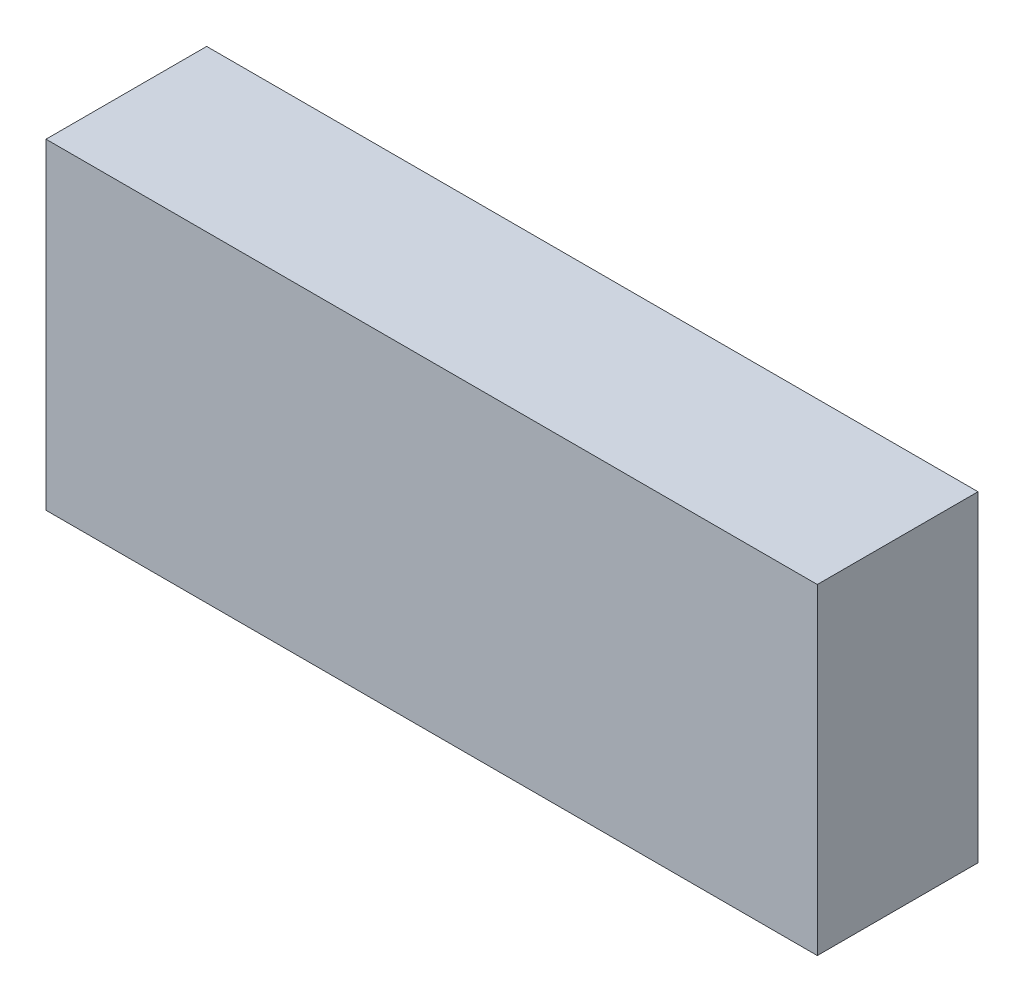
ISO-10303-21;
HEADER;
FILE_DESCRIPTION(('STEP AP214'),'2;1');
FILE_NAME('part.step','',(''),(''),'','','');
FILE_SCHEMA(('AUTOMOTIVE_DESIGN { 1 0 10303 214 1 1 1 1 }'));
ENDSEC;
DATA;
#1=APPLICATION_CONTEXT('core data for automotive mechanical design processes');
#2=APPLICATION_PROTOCOL_DEFINITION('international standard','automotive_design',2000,#1);
#3=PRODUCT_CONTEXT('',#1,'mechanical');
#4=PRODUCT('Part','Part','',(#3));
#5=PRODUCT_RELATED_PRODUCT_CATEGORY('part','',(#4));
#6=PRODUCT_DEFINITION_FORMATION('','',#4);
#7=PRODUCT_DEFINITION_CONTEXT('part definition',#1,'design');
#8=PRODUCT_DEFINITION('design','',#6,#7);
#9=PRODUCT_DEFINITION_SHAPE('','',#8);
#10=(LENGTH_UNIT() NAMED_UNIT(*) SI_UNIT(.MILLI.,.METRE.));
#11=(NAMED_UNIT(*) PLANE_ANGLE_UNIT() SI_UNIT($,.RADIAN.));
#12=(NAMED_UNIT(*) SI_UNIT($,.STERADIAN.) SOLID_ANGLE_UNIT());
#13=UNCERTAINTY_MEASURE_WITH_UNIT(LENGTH_MEASURE(1.E-05),#10,'distance_accuracy_value','');
#14=(GEOMETRIC_REPRESENTATION_CONTEXT(3) GLOBAL_UNCERTAINTY_ASSIGNED_CONTEXT((#13)) GLOBAL_UNIT_ASSIGNED_CONTEXT((#10,
#11,#12)) REPRESENTATION_CONTEXT('',''));
#15=CARTESIAN_POINT('',(0.,0.,0.));
#16=DIRECTION('',(0.,0.,1.));
#17=DIRECTION('',(1.,0.,0.));
#18=AXIS2_PLACEMENT_3D('',#15,#16,#17);
#19=CARTESIAN_POINT('',(0.,0.,62.5));
#20=DIRECTION('',(1.,0.,0.));
#21=DIRECTION('',(0.,0.,-1.));
#22=AXIS2_PLACEMENT_3D('',#19,#20,#21);
#23=PLANE('',#22);
#24=DIRECTION('',(0.,-1.,0.));
#25=VECTOR('',#24,1.);
#26=CARTESIAN_POINT('',(0.,0.,0.));
#27=LINE('',#26,#25);
#28=CARTESIAN_POINT('',(0.,0.,0.));
#29=VERTEX_POINT('',#28);
#30=CARTESIAN_POINT('',(0.,-125.,0.));
#31=VERTEX_POINT('',#30);
#32=EDGE_CURVE('E104',#29,#31,#27,.T.);
#33=ORIENTED_EDGE('',*,*,#32,.T.);
#34=DIRECTION('',(0.,0.,-1.));
#35=VECTOR('',#34,1.);
#36=CARTESIAN_POINT('',(0.,-125.,62.5));
#37=LINE('',#36,#35);
#38=CARTESIAN_POINT('',(0.,-125.,62.5));
#39=VERTEX_POINT('',#38);
#40=EDGE_CURVE('E11',#39,#31,#37,.T.);
#41=ORIENTED_EDGE('',*,*,#40,.F.);
#42=DIRECTION('',(0.,-1.,0.));
#43=VECTOR('',#42,1.);
#44=CARTESIAN_POINT('',(0.,0.,62.5));
#45=LINE('',#44,#43);
#46=CARTESIAN_POINT('',(0.,0.,62.5));
#47=VERTEX_POINT('',#46);
#48=EDGE_CURVE('E92',#47,#39,#45,.T.);
#49=ORIENTED_EDGE('',*,*,#48,.F.);
#50=DIRECTION('',(0.,0.,-1.));
#51=VECTOR('',#50,1.);
#52=CARTESIAN_POINT('',(0.,0.,62.5));
#53=LINE('',#52,#51);
#54=EDGE_CURVE('E100',#47,#29,#53,.T.);
#55=ORIENTED_EDGE('',*,*,#54,.T.);
#56=EDGE_LOOP('',(#33,#41,#49,#55));
#57=FACE_BOUND('',#56,.T.);
#58=ADVANCED_FACE('F41',(#57),#23,.F.);
#59=CARTESIAN_POINT('',(0.,-125.,62.5));
#60=DIRECTION('',(0.,1.,0.));
#61=DIRECTION('',(0.,0.,1.));
#62=AXIS2_PLACEMENT_3D('',#59,#60,#61);
#63=PLANE('',#62);
#64=DIRECTION('',(1.,0.,0.));
#65=VECTOR('',#64,1.);
#66=CARTESIAN_POINT('',(0.,-125.,0.));
#67=LINE('',#66,#65);
#68=CARTESIAN_POINT('',(300.,-125.,0.));
#69=VERTEX_POINT('',#68);
#70=EDGE_CURVE('E96',#31,#69,#67,.T.);
#71=ORIENTED_EDGE('',*,*,#70,.T.);
#72=DIRECTION('',(0.,0.,-1.));
#73=VECTOR('',#72,1.);
#74=CARTESIAN_POINT('',(300.,-125.,62.5));
#75=LINE('',#74,#73);
#76=CARTESIAN_POINT('',(300.,-125.,62.5));
#77=VERTEX_POINT('',#76);
#78=EDGE_CURVE('E49',#77,#69,#75,.T.);
#79=ORIENTED_EDGE('',*,*,#78,.F.);
#80=DIRECTION('',(1.,0.,0.));
#81=VECTOR('',#80,1.);
#82=CARTESIAN_POINT('',(0.,-125.,62.5));
#83=LINE('',#82,#81);
#84=EDGE_CURVE('E87',#39,#77,#83,.T.);
#85=ORIENTED_EDGE('',*,*,#84,.F.);
#86=ORIENTED_EDGE('',*,*,#40,.T.);
#87=EDGE_LOOP('',(#71,#79,#85,#86));
#88=FACE_BOUND('',#87,.T.);
#89=ADVANCED_FACE('F95',(#88),#63,.F.);
#90=CARTESIAN_POINT('',(300.,0.,62.5));
#91=DIRECTION('',(-1.,0.,0.));
#92=DIRECTION('',(0.,0.,1.));
#93=AXIS2_PLACEMENT_3D('',#90,#91,#92);
#94=PLANE('',#93);
#95=DIRECTION('',(0.,1.,0.));
#96=VECTOR('',#95,1.);
#97=CARTESIAN_POINT('',(300.,0.,0.));
#98=LINE('',#97,#96);
#99=CARTESIAN_POINT('',(300.,0.,0.));
#100=VERTEX_POINT('',#99);
#101=EDGE_CURVE('E74',#69,#100,#98,.T.);
#102=ORIENTED_EDGE('',*,*,#101,.T.);
#103=DIRECTION('',(0.,0.,-1.));
#104=VECTOR('',#103,1.);
#105=CARTESIAN_POINT('',(300.,0.,62.5));
#106=LINE('',#105,#104);
#107=CARTESIAN_POINT('',(300.,0.,62.5));
#108=VERTEX_POINT('',#107);
#109=EDGE_CURVE('E97',#108,#100,#106,.T.);
#110=ORIENTED_EDGE('',*,*,#109,.F.);
#111=DIRECTION('',(0.,1.,0.));
#112=VECTOR('',#111,1.);
#113=CARTESIAN_POINT('',(300.,0.,62.5));
#114=LINE('',#113,#112);
#115=EDGE_CURVE('E90',#77,#108,#114,.T.);
#116=ORIENTED_EDGE('',*,*,#115,.F.);
#117=ORIENTED_EDGE('',*,*,#78,.T.);
#118=EDGE_LOOP('',(#102,#110,#116,#117));
#119=FACE_BOUND('',#118,.T.);
#120=ADVANCED_FACE('F98',(#119),#94,.F.);
#121=CARTESIAN_POINT('',(0.,0.,62.5));
#122=DIRECTION('',(0.,-1.,0.));
#123=DIRECTION('',(0.,0.,-1.));
#124=AXIS2_PLACEMENT_3D('',#121,#122,#123);
#125=PLANE('',#124);
#126=DIRECTION('',(-1.,0.,0.));
#127=VECTOR('',#126,1.);
#128=CARTESIAN_POINT('',(0.,0.,0.));
#129=LINE('',#128,#127);
#130=EDGE_CURVE('E80',#100,#29,#129,.T.);
#131=ORIENTED_EDGE('',*,*,#130,.T.);
#132=ORIENTED_EDGE('',*,*,#54,.F.);
#133=DIRECTION('',(-1.,0.,0.));
#134=VECTOR('',#133,1.);
#135=CARTESIAN_POINT('',(0.,0.,62.5));
#136=LINE('',#135,#134);
#137=EDGE_CURVE('E57',#108,#47,#136,.T.);
#138=ORIENTED_EDGE('',*,*,#137,.F.);
#139=ORIENTED_EDGE('',*,*,#109,.T.);
#140=EDGE_LOOP('',(#131,#132,#138,#139));
#141=FACE_BOUND('',#140,.T.);
#142=ADVANCED_FACE('F111',(#141),#125,.F.);
#143=CARTESIAN_POINT('',(0.,0.,62.5));
#144=DIRECTION('',(0.,0.,1.));
#145=DIRECTION('',(1.,0.,0.));
#146=AXIS2_PLACEMENT_3D('',#143,#144,#145);
#147=PLANE('',#146);
#148=ORIENTED_EDGE('',*,*,#48,.T.);
#149=ORIENTED_EDGE('',*,*,#84,.T.);
#150=ORIENTED_EDGE('',*,*,#115,.T.);
#151=ORIENTED_EDGE('',*,*,#137,.T.);
#152=EDGE_LOOP('',(#148,#149,#150,#151));
#153=FACE_BOUND('',#152,.T.);
#154=ADVANCED_FACE('F88',(#153),#147,.T.);
#155=CARTESIAN_POINT('',(0.,0.,0.));
#156=DIRECTION('',(0.,0.,1.));
#157=DIRECTION('',(1.,0.,0.));
#158=AXIS2_PLACEMENT_3D('',#155,#156,#157);
#159=PLANE('',#158);
#160=ORIENTED_EDGE('',*,*,#32,.F.);
#161=ORIENTED_EDGE('',*,*,#130,.F.);
#162=ORIENTED_EDGE('',*,*,#101,.F.);
#163=ORIENTED_EDGE('',*,*,#70,.F.);
#164=EDGE_LOOP('',(#160,#161,#162,#163));
#165=FACE_BOUND('',#164,.T.);
#166=ADVANCED_FACE('F114',(#165),#159,.F.);
#167=CLOSED_SHELL('',(#58,#89,#120,#142,#154,#166));
#168=MANIFOLD_SOLID_BREP('B2',#167);
#169=ADVANCED_BREP_SHAPE_REPRESENTATION('',(#18,#168),#14);
#170=SHAPE_DEFINITION_REPRESENTATION(#9,#169);
ENDSEC;
END-ISO-10303-21;
